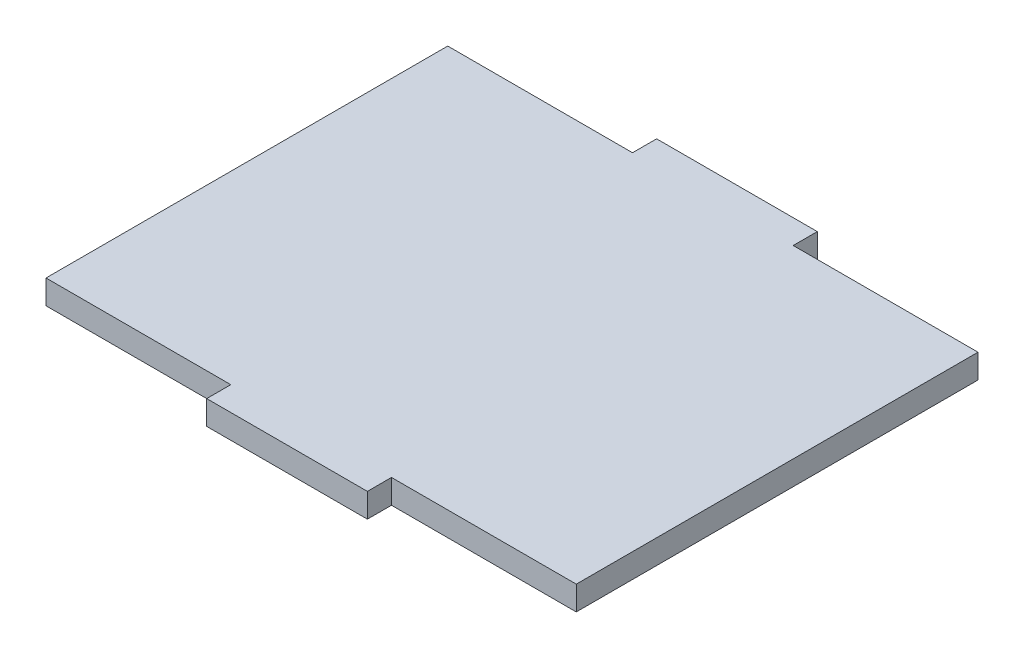
ISO-10303-21;
HEADER;
FILE_DESCRIPTION(('STEP AP214'),'2;1');
FILE_NAME('part.step','',(''),(''),'','','');
FILE_SCHEMA(('AUTOMOTIVE_DESIGN { 1 0 10303 214 1 1 1 1 }'));
ENDSEC;
DATA;
#1=APPLICATION_CONTEXT('core data for automotive mechanical design processes');
#2=APPLICATION_PROTOCOL_DEFINITION('international standard','automotive_design',2000,#1);
#3=PRODUCT_CONTEXT('',#1,'mechanical');
#4=PRODUCT('Part','Part','',(#3));
#5=PRODUCT_RELATED_PRODUCT_CATEGORY('part','',(#4));
#6=PRODUCT_DEFINITION_FORMATION('','',#4);
#7=PRODUCT_DEFINITION_CONTEXT('part definition',#1,'design');
#8=PRODUCT_DEFINITION('design','',#6,#7);
#9=PRODUCT_DEFINITION_SHAPE('','',#8);
#10=(LENGTH_UNIT() NAMED_UNIT(*) SI_UNIT(.MILLI.,.METRE.));
#11=(NAMED_UNIT(*) PLANE_ANGLE_UNIT() SI_UNIT($,.RADIAN.));
#12=(NAMED_UNIT(*) SI_UNIT($,.STERADIAN.) SOLID_ANGLE_UNIT());
#13=UNCERTAINTY_MEASURE_WITH_UNIT(LENGTH_MEASURE(1.E-05),#10,'distance_accuracy_value','');
#14=(GEOMETRIC_REPRESENTATION_CONTEXT(3) GLOBAL_UNCERTAINTY_ASSIGNED_CONTEXT((#13)) GLOBAL_UNIT_ASSIGNED_CONTEXT((#10,
#11,#12)) REPRESENTATION_CONTEXT('',''));
#15=CARTESIAN_POINT('',(0.,0.,0.));
#16=DIRECTION('',(0.,0.,1.));
#17=DIRECTION('',(1.,0.,0.));
#18=AXIS2_PLACEMENT_3D('',#15,#16,#17);
#19=CARTESIAN_POINT('',(0.,3.,0.));
#20=DIRECTION('',(1.,0.,0.));
#21=DIRECTION('',(0.,0.,-1.));
#22=AXIS2_PLACEMENT_3D('',#19,#20,#21);
#23=PLANE('',#22);
#24=DIRECTION('',(0.,0.,1.));
#25=VECTOR('',#24,1.);
#26=CARTESIAN_POINT('',(0.,0.,0.));
#27=LINE('',#26,#25);
#28=CARTESIAN_POINT('',(0.,0.,-50.));
#29=VERTEX_POINT('',#28);
#30=CARTESIAN_POINT('',(0.,0.,0.));
#31=VERTEX_POINT('',#30);
#32=EDGE_CURVE('E159',#29,#31,#27,.T.);
#33=ORIENTED_EDGE('',*,*,#32,.T.);
#34=DIRECTION('',(0.,-1.,0.));
#35=VECTOR('',#34,1.);
#36=CARTESIAN_POINT('',(0.,3.,0.));
#37=LINE('',#36,#35);
#38=CARTESIAN_POINT('',(0.,3.,0.));
#39=VERTEX_POINT('',#38);
#40=EDGE_CURVE('E11',#39,#31,#37,.T.);
#41=ORIENTED_EDGE('',*,*,#40,.F.);
#42=DIRECTION('',(0.,0.,1.));
#43=VECTOR('',#42,1.);
#44=CARTESIAN_POINT('',(0.,3.,0.));
#45=LINE('',#44,#43);
#46=CARTESIAN_POINT('',(0.,3.,-50.));
#47=VERTEX_POINT('',#46);
#48=EDGE_CURVE('E181',#47,#39,#45,.T.);
#49=ORIENTED_EDGE('',*,*,#48,.F.);
#50=DIRECTION('',(0.,-1.,0.));
#51=VECTOR('',#50,1.);
#52=CARTESIAN_POINT('',(0.,3.,-50.));
#53=LINE('',#52,#51);
#54=EDGE_CURVE('E155',#47,#29,#53,.T.);
#55=ORIENTED_EDGE('',*,*,#54,.T.);
#56=EDGE_LOOP('',(#33,#41,#49,#55));
#57=FACE_BOUND('',#56,.T.);
#58=ADVANCED_FACE('F39',(#57),#23,.F.);
#59=CARTESIAN_POINT('',(0.,3.,0.));
#60=DIRECTION('',(0.,0.,-1.));
#61=DIRECTION('',(-1.,0.,0.));
#62=AXIS2_PLACEMENT_3D('',#59,#60,#61);
#63=PLANE('',#62);
#64=DIRECTION('',(1.,0.,0.));
#65=VECTOR('',#64,1.);
#66=CARTESIAN_POINT('',(0.,0.,0.));
#67=LINE('',#66,#65);
#68=CARTESIAN_POINT('',(23.,0.,0.));
#69=VERTEX_POINT('',#68);
#70=EDGE_CURVE('E162',#31,#69,#67,.T.);
#71=ORIENTED_EDGE('',*,*,#70,.T.);
#72=DIRECTION('',(0.,-1.,0.));
#73=VECTOR('',#72,1.);
#74=CARTESIAN_POINT('',(23.,3.,0.));
#75=LINE('',#74,#73);
#76=CARTESIAN_POINT('',(23.,3.,0.));
#77=VERTEX_POINT('',#76);
#78=EDGE_CURVE('E47',#77,#69,#75,.T.);
#79=ORIENTED_EDGE('',*,*,#78,.F.);
#80=DIRECTION('',(1.,0.,0.));
#81=VECTOR('',#80,1.);
#82=CARTESIAN_POINT('',(0.,3.,0.));
#83=LINE('',#82,#81);
#84=EDGE_CURVE('E110',#39,#77,#83,.T.);
#85=ORIENTED_EDGE('',*,*,#84,.F.);
#86=ORIENTED_EDGE('',*,*,#40,.T.);
#87=EDGE_LOOP('',(#71,#79,#85,#86));
#88=FACE_BOUND('',#87,.T.);
#89=ADVANCED_FACE('F259',(#88),#63,.F.);
#90=CARTESIAN_POINT('',(23.,3.,0.));
#91=DIRECTION('',(1.,0.,0.));
#92=DIRECTION('',(0.,0.,-1.));
#93=AXIS2_PLACEMENT_3D('',#90,#91,#92);
#94=PLANE('',#93);
#95=DIRECTION('',(0.,0.,1.));
#96=VECTOR('',#95,1.);
#97=CARTESIAN_POINT('',(23.,0.,0.));
#98=LINE('',#97,#96);
#99=CARTESIAN_POINT('',(23.,0.,3.));
#100=VERTEX_POINT('',#99);
#101=EDGE_CURVE('E164',#69,#100,#98,.T.);
#102=ORIENTED_EDGE('',*,*,#101,.T.);
#103=DIRECTION('',(0.,-1.,0.));
#104=VECTOR('',#103,1.);
#105=CARTESIAN_POINT('',(23.,3.,3.));
#106=LINE('',#105,#104);
#107=CARTESIAN_POINT('',(23.,3.,3.));
#108=VERTEX_POINT('',#107);
#109=EDGE_CURVE('E200',#108,#100,#106,.T.);
#110=ORIENTED_EDGE('',*,*,#109,.F.);
#111=DIRECTION('',(0.,0.,1.));
#112=VECTOR('',#111,1.);
#113=CARTESIAN_POINT('',(23.,3.,0.));
#114=LINE('',#113,#112);
#115=EDGE_CURVE('E208',#77,#108,#114,.T.);
#116=ORIENTED_EDGE('',*,*,#115,.F.);
#117=ORIENTED_EDGE('',*,*,#78,.T.);
#118=EDGE_LOOP('',(#102,#110,#116,#117));
#119=FACE_BOUND('',#118,.T.);
#120=ADVANCED_FACE('F206',(#119),#94,.F.);
#121=CARTESIAN_POINT('',(23.,3.,3.));
#122=DIRECTION('',(0.,0.,-1.));
#123=DIRECTION('',(-1.,0.,0.));
#124=AXIS2_PLACEMENT_3D('',#121,#122,#123);
#125=PLANE('',#124);
#126=DIRECTION('',(1.,0.,0.));
#127=VECTOR('',#126,1.);
#128=CARTESIAN_POINT('',(23.,0.,3.));
#129=LINE('',#128,#127);
#130=CARTESIAN_POINT('',(43.,0.,3.00000000000001));
#131=VERTEX_POINT('',#130);
#132=EDGE_CURVE('E166',#100,#131,#129,.T.);
#133=ORIENTED_EDGE('',*,*,#132,.T.);
#134=DIRECTION('',(0.,-1.,0.));
#135=VECTOR('',#134,1.);
#136=CARTESIAN_POINT('',(43.,3.,3.00000000000001));
#137=LINE('',#136,#135);
#138=CARTESIAN_POINT('',(43.,3.,3.00000000000001));
#139=VERTEX_POINT('',#138);
#140=EDGE_CURVE('E197',#139,#131,#137,.T.);
#141=ORIENTED_EDGE('',*,*,#140,.F.);
#142=DIRECTION('',(1.,0.,0.));
#143=VECTOR('',#142,1.);
#144=CARTESIAN_POINT('',(23.,3.,3.));
#145=LINE('',#144,#143);
#146=EDGE_CURVE('E226',#108,#139,#145,.T.);
#147=ORIENTED_EDGE('',*,*,#146,.F.);
#148=ORIENTED_EDGE('',*,*,#109,.T.);
#149=EDGE_LOOP('',(#133,#141,#147,#148));
#150=FACE_BOUND('',#149,.T.);
#151=ADVANCED_FACE('F217',(#150),#125,.F.);
#152=CARTESIAN_POINT('',(43.,3.,0.));
#153=DIRECTION('',(-1.,0.,0.));
#154=DIRECTION('',(0.,0.,1.));
#155=AXIS2_PLACEMENT_3D('',#152,#153,#154);
#156=PLANE('',#155);
#157=DIRECTION('',(0.,0.,-1.));
#158=VECTOR('',#157,1.);
#159=CARTESIAN_POINT('',(43.,0.,0.));
#160=LINE('',#159,#158);
#161=CARTESIAN_POINT('',(43.,0.,0.));
#162=VERTEX_POINT('',#161);
#163=EDGE_CURVE('E168',#131,#162,#160,.T.);
#164=ORIENTED_EDGE('',*,*,#163,.T.);
#165=DIRECTION('',(0.,-1.,0.));
#166=VECTOR('',#165,1.);
#167=CARTESIAN_POINT('',(43.,3.,0.));
#168=LINE('',#167,#166);
#169=CARTESIAN_POINT('',(43.,3.,0.));
#170=VERTEX_POINT('',#169);
#171=EDGE_CURVE('E194',#170,#162,#168,.T.);
#172=ORIENTED_EDGE('',*,*,#171,.F.);
#173=DIRECTION('',(0.,0.,-1.));
#174=VECTOR('',#173,1.);
#175=CARTESIAN_POINT('',(43.,3.,0.));
#176=LINE('',#175,#174);
#177=EDGE_CURVE('E223',#139,#170,#176,.T.);
#178=ORIENTED_EDGE('',*,*,#177,.F.);
#179=ORIENTED_EDGE('',*,*,#140,.T.);
#180=EDGE_LOOP('',(#164,#172,#178,#179));
#181=FACE_BOUND('',#180,.T.);
#182=ADVANCED_FACE('F221',(#181),#156,.F.);
#183=CARTESIAN_POINT('',(43.,3.,0.));
#184=DIRECTION('',(0.,0.,-1.));
#185=DIRECTION('',(-1.,0.,0.));
#186=AXIS2_PLACEMENT_3D('',#183,#184,#185);
#187=PLANE('',#186);
#188=DIRECTION('',(1.,0.,0.));
#189=VECTOR('',#188,1.);
#190=CARTESIAN_POINT('',(43.,0.,0.));
#191=LINE('',#190,#189);
#192=CARTESIAN_POINT('',(66.,0.,0.));
#193=VERTEX_POINT('',#192);
#194=EDGE_CURVE('E170',#162,#193,#191,.T.);
#195=ORIENTED_EDGE('',*,*,#194,.T.);
#196=DIRECTION('',(0.,-1.,0.));
#197=VECTOR('',#196,1.);
#198=CARTESIAN_POINT('',(66.,3.,0.));
#199=LINE('',#198,#197);
#200=CARTESIAN_POINT('',(66.,3.,0.));
#201=VERTEX_POINT('',#200);
#202=EDGE_CURVE('E191',#201,#193,#199,.T.);
#203=ORIENTED_EDGE('',*,*,#202,.F.);
#204=DIRECTION('',(1.,0.,0.));
#205=VECTOR('',#204,1.);
#206=CARTESIAN_POINT('',(43.,3.,0.));
#207=LINE('',#206,#205);
#208=EDGE_CURVE('E225',#170,#201,#207,.T.);
#209=ORIENTED_EDGE('',*,*,#208,.F.);
#210=ORIENTED_EDGE('',*,*,#171,.T.);
#211=EDGE_LOOP('',(#195,#203,#209,#210));
#212=FACE_BOUND('',#211,.T.);
#213=ADVANCED_FACE('F272',(#212),#187,.F.);
#214=CARTESIAN_POINT('',(66.,3.,0.));
#215=DIRECTION('',(-1.,0.,0.));
#216=DIRECTION('',(0.,0.,1.));
#217=AXIS2_PLACEMENT_3D('',#214,#215,#216);
#218=PLANE('',#217);
#219=DIRECTION('',(0.,0.,-1.));
#220=VECTOR('',#219,1.);
#221=CARTESIAN_POINT('',(66.,0.,0.));
#222=LINE('',#221,#220);
#223=CARTESIAN_POINT('',(66.,0.,-50.));
#224=VERTEX_POINT('',#223);
#225=EDGE_CURVE('E172',#193,#224,#222,.T.);
#226=ORIENTED_EDGE('',*,*,#225,.T.);
#227=DIRECTION('',(0.,-1.,0.));
#228=VECTOR('',#227,1.);
#229=CARTESIAN_POINT('',(66.,3.,-50.));
#230=LINE('',#229,#228);
#231=CARTESIAN_POINT('',(66.,3.,-50.));
#232=VERTEX_POINT('',#231);
#233=EDGE_CURVE('E188',#232,#224,#230,.T.);
#234=ORIENTED_EDGE('',*,*,#233,.F.);
#235=DIRECTION('',(0.,0.,-1.));
#236=VECTOR('',#235,1.);
#237=CARTESIAN_POINT('',(66.,3.,0.));
#238=LINE('',#237,#236);
#239=EDGE_CURVE('E228',#201,#232,#238,.T.);
#240=ORIENTED_EDGE('',*,*,#239,.F.);
#241=ORIENTED_EDGE('',*,*,#202,.T.);
#242=EDGE_LOOP('',(#226,#234,#240,#241));
#243=FACE_BOUND('',#242,.T.);
#244=ADVANCED_FACE('F275',(#243),#218,.F.);
#245=CARTESIAN_POINT('',(43.,3.,-50.));
#246=DIRECTION('',(0.,0.,1.));
#247=DIRECTION('',(1.,0.,0.));
#248=AXIS2_PLACEMENT_3D('',#245,#246,#247);
#249=PLANE('',#248);
#250=DIRECTION('',(-1.,0.,0.));
#251=VECTOR('',#250,1.);
#252=CARTESIAN_POINT('',(43.,0.,-50.));
#253=LINE('',#252,#251);
#254=CARTESIAN_POINT('',(43.,0.,-50.));
#255=VERTEX_POINT('',#254);
#256=EDGE_CURVE('E174',#224,#255,#253,.T.);
#257=ORIENTED_EDGE('',*,*,#256,.T.);
#258=DIRECTION('',(0.,-1.,0.));
#259=VECTOR('',#258,1.);
#260=CARTESIAN_POINT('',(43.,3.,-50.));
#261=LINE('',#260,#259);
#262=CARTESIAN_POINT('',(43.,3.,-50.));
#263=VERTEX_POINT('',#262);
#264=EDGE_CURVE('E185',#263,#255,#261,.T.);
#265=ORIENTED_EDGE('',*,*,#264,.F.);
#266=DIRECTION('',(-1.,0.,0.));
#267=VECTOR('',#266,1.);
#268=CARTESIAN_POINT('',(43.,3.,-50.));
#269=LINE('',#268,#267);
#270=EDGE_CURVE('E234',#232,#263,#269,.T.);
#271=ORIENTED_EDGE('',*,*,#270,.F.);
#272=ORIENTED_EDGE('',*,*,#233,.T.);
#273=EDGE_LOOP('',(#257,#265,#271,#272));
#274=FACE_BOUND('',#273,.T.);
#275=ADVANCED_FACE('F240',(#274),#249,.F.);
#276=CARTESIAN_POINT('',(43.,3.,-50.));
#277=DIRECTION('',(-1.,0.,0.));
#278=DIRECTION('',(0.,0.,1.));
#279=AXIS2_PLACEMENT_3D('',#276,#277,#278);
#280=PLANE('',#279);
#281=DIRECTION('',(0.,0.,-1.));
#282=VECTOR('',#281,1.);
#283=CARTESIAN_POINT('',(43.,0.,-50.));
#284=LINE('',#283,#282);
#285=CARTESIAN_POINT('',(43.,0.,-53.));
#286=VERTEX_POINT('',#285);
#287=EDGE_CURVE('E176',#255,#286,#284,.T.);
#288=ORIENTED_EDGE('',*,*,#287,.T.);
#289=DIRECTION('',(0.,-1.,0.));
#290=VECTOR('',#289,1.);
#291=CARTESIAN_POINT('',(43.,3.,-53.));
#292=LINE('',#291,#290);
#293=CARTESIAN_POINT('',(43.,3.,-53.));
#294=VERTEX_POINT('',#293);
#295=EDGE_CURVE('E150',#294,#286,#292,.T.);
#296=ORIENTED_EDGE('',*,*,#295,.F.);
#297=DIRECTION('',(0.,0.,-1.));
#298=VECTOR('',#297,1.);
#299=CARTESIAN_POINT('',(43.,3.,-50.));
#300=LINE('',#299,#298);
#301=EDGE_CURVE('E141',#263,#294,#300,.T.);
#302=ORIENTED_EDGE('',*,*,#301,.F.);
#303=ORIENTED_EDGE('',*,*,#264,.T.);
#304=EDGE_LOOP('',(#288,#296,#302,#303));
#305=FACE_BOUND('',#304,.T.);
#306=ADVANCED_FACE('F244',(#305),#280,.F.);
#307=CARTESIAN_POINT('',(23.,3.,-53.));
#308=DIRECTION('',(0.,0.,1.));
#309=DIRECTION('',(1.,0.,0.));
#310=AXIS2_PLACEMENT_3D('',#307,#308,#309);
#311=PLANE('',#310);
#312=DIRECTION('',(-1.,0.,0.));
#313=VECTOR('',#312,1.);
#314=CARTESIAN_POINT('',(23.,0.,-53.));
#315=LINE('',#314,#313);
#316=CARTESIAN_POINT('',(23.,0.,-53.));
#317=VERTEX_POINT('',#316);
#318=EDGE_CURVE('E149',#286,#317,#315,.T.);
#319=ORIENTED_EDGE('',*,*,#318,.T.);
#320=DIRECTION('',(0.,-1.,0.));
#321=VECTOR('',#320,1.);
#322=CARTESIAN_POINT('',(23.,3.,-53.));
#323=LINE('',#322,#321);
#324=CARTESIAN_POINT('',(23.,3.,-53.));
#325=VERTEX_POINT('',#324);
#326=EDGE_CURVE('E146',#325,#317,#323,.T.);
#327=ORIENTED_EDGE('',*,*,#326,.F.);
#328=DIRECTION('',(-1.,0.,0.));
#329=VECTOR('',#328,1.);
#330=CARTESIAN_POINT('',(23.,3.,-53.));
#331=LINE('',#330,#329);
#332=EDGE_CURVE('E135',#294,#325,#331,.T.);
#333=ORIENTED_EDGE('',*,*,#332,.F.);
#334=ORIENTED_EDGE('',*,*,#295,.T.);
#335=EDGE_LOOP('',(#319,#327,#333,#334));
#336=FACE_BOUND('',#335,.T.);
#337=ADVANCED_FACE('F147',(#336),#311,.F.);
#338=CARTESIAN_POINT('',(23.,3.,-50.));
#339=DIRECTION('',(1.,0.,0.));
#340=DIRECTION('',(0.,0.,-1.));
#341=AXIS2_PLACEMENT_3D('',#338,#339,#340);
#342=PLANE('',#341);
#343=DIRECTION('',(0.,0.,1.));
#344=VECTOR('',#343,1.);
#345=CARTESIAN_POINT('',(23.,0.,-50.));
#346=LINE('',#345,#344);
#347=CARTESIAN_POINT('',(23.,0.,-50.));
#348=VERTEX_POINT('',#347);
#349=EDGE_CURVE('E96',#317,#348,#346,.T.);
#350=ORIENTED_EDGE('',*,*,#349,.T.);
#351=DIRECTION('',(0.,-1.,0.));
#352=VECTOR('',#351,1.);
#353=CARTESIAN_POINT('',(23.,3.,-50.));
#354=LINE('',#353,#352);
#355=CARTESIAN_POINT('',(23.,3.,-50.));
#356=VERTEX_POINT('',#355);
#357=EDGE_CURVE('E151',#356,#348,#354,.T.);
#358=ORIENTED_EDGE('',*,*,#357,.F.);
#359=DIRECTION('',(0.,0.,1.));
#360=VECTOR('',#359,1.);
#361=CARTESIAN_POINT('',(23.,3.,-50.));
#362=LINE('',#361,#360);
#363=EDGE_CURVE('E139',#325,#356,#362,.T.);
#364=ORIENTED_EDGE('',*,*,#363,.F.);
#365=ORIENTED_EDGE('',*,*,#326,.T.);
#366=EDGE_LOOP('',(#350,#358,#364,#365));
#367=FACE_BOUND('',#366,.T.);
#368=ADVANCED_FACE('F153',(#367),#342,.F.);
#369=CARTESIAN_POINT('',(0.,3.,-50.));
#370=DIRECTION('',(0.,0.,1.));
#371=DIRECTION('',(1.,0.,0.));
#372=AXIS2_PLACEMENT_3D('',#369,#370,#371);
#373=PLANE('',#372);
#374=DIRECTION('',(-1.,0.,0.));
#375=VECTOR('',#374,1.);
#376=CARTESIAN_POINT('',(0.,0.,-50.));
#377=LINE('',#376,#375);
#378=EDGE_CURVE('E102',#348,#29,#377,.T.);
#379=ORIENTED_EDGE('',*,*,#378,.T.);
#380=ORIENTED_EDGE('',*,*,#54,.F.);
#381=DIRECTION('',(-1.,0.,0.));
#382=VECTOR('',#381,1.);
#383=CARTESIAN_POINT('',(0.,3.,-50.));
#384=LINE('',#383,#382);
#385=EDGE_CURVE('E55',#356,#47,#384,.T.);
#386=ORIENTED_EDGE('',*,*,#385,.F.);
#387=ORIENTED_EDGE('',*,*,#357,.T.);
#388=EDGE_LOOP('',(#379,#380,#386,#387));
#389=FACE_BOUND('',#388,.T.);
#390=ADVANCED_FACE('F248',(#389),#373,.F.);
#391=CARTESIAN_POINT('',(0.,3.,0.));
#392=DIRECTION('',(0.,-1.,0.));
#393=DIRECTION('',(0.,0.,-1.));
#394=AXIS2_PLACEMENT_3D('',#391,#392,#393);
#395=PLANE('',#394);
#396=ORIENTED_EDGE('',*,*,#48,.T.);
#397=ORIENTED_EDGE('',*,*,#84,.T.);
#398=ORIENTED_EDGE('',*,*,#115,.T.);
#399=ORIENTED_EDGE('',*,*,#146,.T.);
#400=ORIENTED_EDGE('',*,*,#177,.T.);
#401=ORIENTED_EDGE('',*,*,#208,.T.);
#402=ORIENTED_EDGE('',*,*,#239,.T.);
#403=ORIENTED_EDGE('',*,*,#270,.T.);
#404=ORIENTED_EDGE('',*,*,#301,.T.);
#405=ORIENTED_EDGE('',*,*,#332,.T.);
#406=ORIENTED_EDGE('',*,*,#363,.T.);
#407=ORIENTED_EDGE('',*,*,#385,.T.);
#408=EDGE_LOOP('',(#396,#397,#398,#399,#400,#401,#402,#403,#404,#405,#406,#407));
#409=FACE_BOUND('',#408,.T.);
#410=ADVANCED_FACE('F137',(#409),#395,.F.);
#411=CARTESIAN_POINT('',(0.,0.,0.));
#412=DIRECTION('',(0.,-1.,0.));
#413=DIRECTION('',(0.,0.,-1.));
#414=AXIS2_PLACEMENT_3D('',#411,#412,#413);
#415=PLANE('',#414);
#416=ORIENTED_EDGE('',*,*,#32,.F.);
#417=ORIENTED_EDGE('',*,*,#378,.F.);
#418=ORIENTED_EDGE('',*,*,#349,.F.);
#419=ORIENTED_EDGE('',*,*,#318,.F.);
#420=ORIENTED_EDGE('',*,*,#287,.F.);
#421=ORIENTED_EDGE('',*,*,#256,.F.);
#422=ORIENTED_EDGE('',*,*,#225,.F.);
#423=ORIENTED_EDGE('',*,*,#194,.F.);
#424=ORIENTED_EDGE('',*,*,#163,.F.);
#425=ORIENTED_EDGE('',*,*,#132,.F.);
#426=ORIENTED_EDGE('',*,*,#101,.F.);
#427=ORIENTED_EDGE('',*,*,#70,.F.);
#428=EDGE_LOOP('',(#416,#417,#418,#419,#420,#421,#422,#423,#424,#425,#426,#427));
#429=FACE_BOUND('',#428,.T.);
#430=ADVANCED_FACE('F212',(#429),#415,.T.);
#431=CLOSED_SHELL('',(#58,#89,#120,#151,#182,#213,#244,#275,#306,#337,#368,#390,#410,#430));
#432=MANIFOLD_SOLID_BREP('B2',#431);
#433=ADVANCED_BREP_SHAPE_REPRESENTATION('',(#18,#432),#14);
#434=SHAPE_DEFINITION_REPRESENTATION(#9,#433);
ENDSEC;
END-ISO-10303-21;
